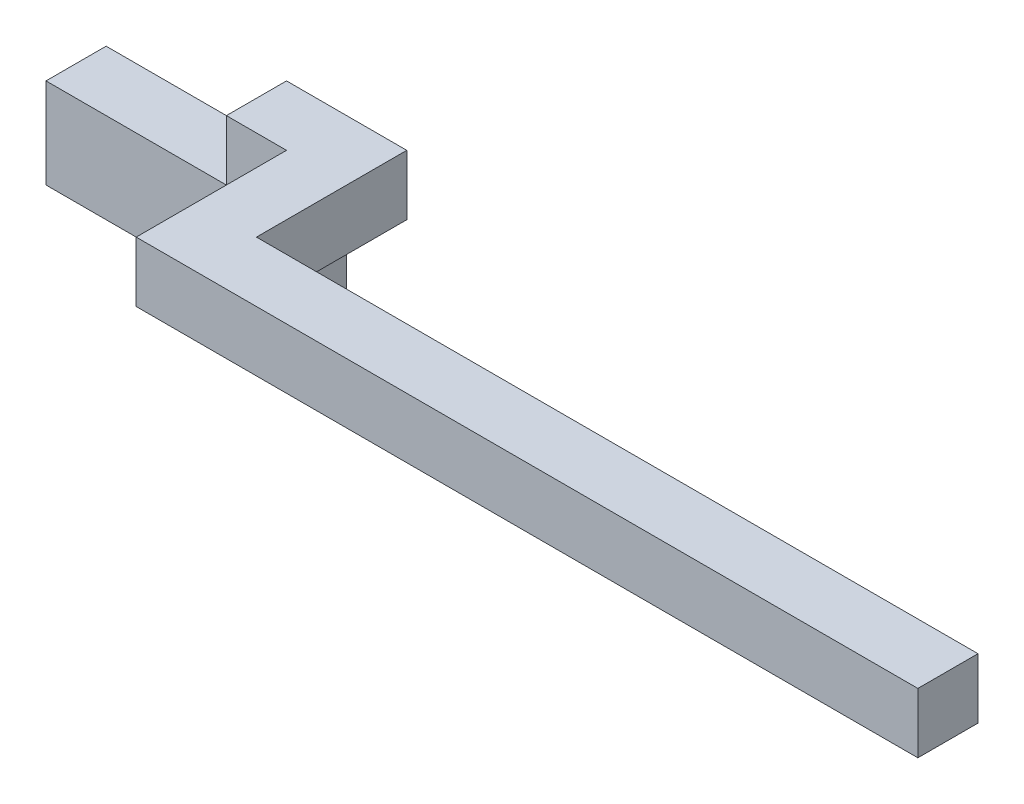
ISO-10303-21;
HEADER;
FILE_DESCRIPTION(('STEP AP214'),'2;1');
FILE_NAME('part.step','',(''),(''),'','','');
FILE_SCHEMA(('AUTOMOTIVE_DESIGN { 1 0 10303 214 1 1 1 1 }'));
ENDSEC;
DATA;
#1=APPLICATION_CONTEXT('core data for automotive mechanical design processes');
#2=APPLICATION_PROTOCOL_DEFINITION('international standard','automotive_design',2000,#1);
#3=PRODUCT_CONTEXT('',#1,'mechanical');
#4=PRODUCT('Part','Part','',(#3));
#5=PRODUCT_RELATED_PRODUCT_CATEGORY('part','',(#4));
#6=PRODUCT_DEFINITION_FORMATION('','',#4);
#7=PRODUCT_DEFINITION_CONTEXT('part definition',#1,'design');
#8=PRODUCT_DEFINITION('design','',#6,#7);
#9=PRODUCT_DEFINITION_SHAPE('','',#8);
#10=(LENGTH_UNIT() NAMED_UNIT(*) SI_UNIT(.MILLI.,.METRE.));
#11=(NAMED_UNIT(*) PLANE_ANGLE_UNIT() SI_UNIT($,.RADIAN.));
#12=(NAMED_UNIT(*) SI_UNIT($,.STERADIAN.) SOLID_ANGLE_UNIT());
#13=UNCERTAINTY_MEASURE_WITH_UNIT(LENGTH_MEASURE(1.E-05),#10,'distance_accuracy_value','');
#14=(GEOMETRIC_REPRESENTATION_CONTEXT(3) GLOBAL_UNCERTAINTY_ASSIGNED_CONTEXT((#13)) GLOBAL_UNIT_ASSIGNED_CONTEXT((#10,
#11,#12)) REPRESENTATION_CONTEXT('',''));
#15=CARTESIAN_POINT('',(0.,0.,0.));
#16=DIRECTION('',(0.,0.,1.));
#17=DIRECTION('',(1.,0.,0.));
#18=AXIS2_PLACEMENT_3D('',#15,#16,#17);
#19=CARTESIAN_POINT('',(330.2,-38.1,0.));
#20=DIRECTION('',(1.,0.,0.));
#21=DIRECTION('',(0.,0.,-1.));
#22=AXIS2_PLACEMENT_3D('',#19,#20,#21);
#23=PLANE('',#22);
#24=DIRECTION('',(0.,1.,0.));
#25=VECTOR('',#24,1.);
#26=CARTESIAN_POINT('',(330.2,-38.1,63.5));
#27=LINE('',#26,#25);
#28=CARTESIAN_POINT('',(330.2,0.,63.5));
#29=VERTEX_POINT('',#28);
#30=CARTESIAN_POINT('',(330.2,25.4,63.5));
#31=VERTEX_POINT('',#30);
#32=EDGE_CURVE('E192',#29,#31,#27,.T.);
#33=ORIENTED_EDGE('',*,*,#32,.T.);
#34=DIRECTION('',(0.,0.,1.));
#35=VECTOR('',#34,1.);
#36=CARTESIAN_POINT('',(330.2,25.4,0.));
#37=LINE('',#36,#35);
#38=CARTESIAN_POINT('',(330.2,25.4,88.9));
#39=VERTEX_POINT('',#38);
#40=EDGE_CURVE('E156',#31,#39,#37,.T.);
#41=ORIENTED_EDGE('',*,*,#40,.T.);
#42=DIRECTION('',(0.,1.,0.));
#43=VECTOR('',#42,1.);
#44=CARTESIAN_POINT('',(330.2,25.4,88.9));
#45=LINE('',#44,#43);
#46=CARTESIAN_POINT('',(330.2,0.,88.9));
#47=VERTEX_POINT('',#46);
#48=EDGE_CURVE('E169',#47,#39,#45,.T.);
#49=ORIENTED_EDGE('',*,*,#48,.F.);
#50=DIRECTION('',(0.,0.,-1.));
#51=VECTOR('',#50,1.);
#52=CARTESIAN_POINT('',(330.2,0.,25.4));
#53=LINE('',#52,#51);
#54=EDGE_CURVE('E164',#47,#29,#53,.T.);
#55=ORIENTED_EDGE('',*,*,#54,.T.);
#56=EDGE_LOOP('',(#33,#41,#49,#55));
#57=FACE_BOUND('',#56,.T.);
#58=ADVANCED_FACE('F33',(#57),#23,.T.);
#59=CARTESIAN_POINT('',(-101.6,-38.1,0.));
#60=DIRECTION('',(0.,-1.,0.));
#61=DIRECTION('',(0.,0.,-1.));
#62=AXIS2_PLACEMENT_3D('',#59,#60,#61);
#63=PLANE('',#62);
#64=DIRECTION('',(0.,0.,-1.));
#65=VECTOR('',#64,1.);
#66=CARTESIAN_POINT('',(0.,-38.1,25.4));
#67=LINE('',#66,#65);
#68=CARTESIAN_POINT('',(0.,-38.1,25.4));
#69=VERTEX_POINT('',#68);
#70=CARTESIAN_POINT('',(0.,-38.1,0.));
#71=VERTEX_POINT('',#70);
#72=EDGE_CURVE('E151',#69,#71,#67,.T.);
#73=ORIENTED_EDGE('',*,*,#72,.F.);
#74=DIRECTION('',(1.,0.,0.));
#75=VECTOR('',#74,1.);
#76=CARTESIAN_POINT('',(-101.6,-38.1,25.4));
#77=LINE('',#76,#75);
#78=CARTESIAN_POINT('',(-101.6,-38.1,25.4));
#79=VERTEX_POINT('',#78);
#80=EDGE_CURVE('E143',#79,#69,#77,.T.);
#81=ORIENTED_EDGE('',*,*,#80,.F.);
#82=DIRECTION('',(0.,0.,1.));
#83=VECTOR('',#82,1.);
#84=CARTESIAN_POINT('',(-101.6,-38.1,0.));
#85=LINE('',#84,#83);
#86=CARTESIAN_POINT('',(-101.6,-38.1,0.));
#87=VERTEX_POINT('',#86);
#88=EDGE_CURVE('E179',#87,#79,#85,.T.);
#89=ORIENTED_EDGE('',*,*,#88,.F.);
#90=DIRECTION('',(1.,0.,0.));
#91=VECTOR('',#90,1.);
#92=CARTESIAN_POINT('',(-101.6,-38.1,0.));
#93=LINE('',#92,#91);
#94=EDGE_CURVE('E145',#87,#71,#93,.T.);
#95=ORIENTED_EDGE('',*,*,#94,.T.);
#96=EDGE_LOOP('',(#73,#81,#89,#95));
#97=FACE_BOUND('',#96,.T.);
#98=ADVANCED_FACE('F227',(#97),#63,.T.);
#99=CARTESIAN_POINT('',(-101.6,25.4,0.));
#100=DIRECTION('',(-1.,0.,0.));
#101=DIRECTION('',(0.,-1.,0.));
#102=AXIS2_PLACEMENT_3D('',#99,#100,#101);
#103=PLANE('',#102);
#104=DIRECTION('',(0.,0.,1.));
#105=VECTOR('',#104,1.);
#106=CARTESIAN_POINT('',(-101.6,0.,0.));
#107=LINE('',#106,#105);
#108=CARTESIAN_POINT('',(-101.6,0.,0.));
#109=VERTEX_POINT('',#108);
#110=CARTESIAN_POINT('',(-101.6,0.,25.4));
#111=VERTEX_POINT('',#110);
#112=EDGE_CURVE('E55',#109,#111,#107,.T.);
#113=ORIENTED_EDGE('',*,*,#112,.F.);
#114=DIRECTION('',(0.,-1.,0.));
#115=VECTOR('',#114,1.);
#116=CARTESIAN_POINT('',(-101.6,25.4,0.));
#117=LINE('',#116,#115);
#118=EDGE_CURVE('E142',#109,#87,#117,.T.);
#119=ORIENTED_EDGE('',*,*,#118,.T.);
#120=ORIENTED_EDGE('',*,*,#88,.T.);
#121=DIRECTION('',(0.,-1.,0.));
#122=VECTOR('',#121,1.);
#123=CARTESIAN_POINT('',(-101.6,25.4,25.4));
#124=LINE('',#123,#122);
#125=EDGE_CURVE('E148',#111,#79,#124,.T.);
#126=ORIENTED_EDGE('',*,*,#125,.F.);
#127=EDGE_LOOP('',(#113,#119,#120,#126));
#128=FACE_BOUND('',#127,.T.);
#129=ADVANCED_FACE('F232',(#128),#103,.T.);
#130=CARTESIAN_POINT('',(330.2,25.4,0.));
#131=DIRECTION('',(0.,1.,0.));
#132=DIRECTION('',(0.,0.,1.));
#133=AXIS2_PLACEMENT_3D('',#130,#131,#132);
#134=PLANE('',#133);
#135=DIRECTION('',(1.,0.,0.));
#136=VECTOR('',#135,1.);
#137=CARTESIAN_POINT('',(25.4,25.4,63.5));
#138=LINE('',#137,#136);
#139=CARTESIAN_POINT('',(25.4,25.4,63.5));
#140=VERTEX_POINT('',#139);
#141=EDGE_CURVE('E127',#140,#31,#138,.T.);
#142=ORIENTED_EDGE('',*,*,#141,.F.);
#143=DIRECTION('',(0.,0.,1.));
#144=VECTOR('',#143,1.);
#145=CARTESIAN_POINT('',(25.4,25.4,0.));
#146=LINE('',#145,#144);
#147=CARTESIAN_POINT('',(25.4,25.4,0.));
#148=VERTEX_POINT('',#147);
#149=EDGE_CURVE('E120',#148,#140,#146,.T.);
#150=ORIENTED_EDGE('',*,*,#149,.F.);
#151=DIRECTION('',(-1.,0.,0.));
#152=VECTOR('',#151,1.);
#153=CARTESIAN_POINT('',(330.2,25.4,0.));
#154=LINE('',#153,#152);
#155=CARTESIAN_POINT('',(-25.4,25.4,0.));
#156=VERTEX_POINT('',#155);
#157=EDGE_CURVE('E132',#148,#156,#154,.T.);
#158=ORIENTED_EDGE('',*,*,#157,.T.);
#159=DIRECTION('',(0.,0.,1.));
#160=VECTOR('',#159,1.);
#161=CARTESIAN_POINT('',(-25.4,25.4,0.));
#162=LINE('',#161,#160);
#163=CARTESIAN_POINT('',(-25.4,25.4,25.4));
#164=VERTEX_POINT('',#163);
#165=EDGE_CURVE('E170',#156,#164,#162,.T.);
#166=ORIENTED_EDGE('',*,*,#165,.T.);
#167=DIRECTION('',(-1.,0.,0.));
#168=VECTOR('',#167,1.);
#169=CARTESIAN_POINT('',(330.2,25.4,25.4));
#170=LINE('',#169,#168);
#171=CARTESIAN_POINT('',(0.,25.4,25.4));
#172=VERTEX_POINT('',#171);
#173=EDGE_CURVE('E160',#172,#164,#170,.T.);
#174=ORIENTED_EDGE('',*,*,#173,.F.);
#175=DIRECTION('',(0.,0.,-1.));
#176=VECTOR('',#175,1.);
#177=CARTESIAN_POINT('',(0.,25.4,88.9));
#178=LINE('',#177,#176);
#179=CARTESIAN_POINT('',(0.,25.4,88.9));
#180=VERTEX_POINT('',#179);
#181=EDGE_CURVE('E173',#180,#172,#178,.T.);
#182=ORIENTED_EDGE('',*,*,#181,.F.);
#183=DIRECTION('',(-1.,0.,0.));
#184=VECTOR('',#183,1.);
#185=CARTESIAN_POINT('',(0.,25.4,88.9));
#186=LINE('',#185,#184);
#187=EDGE_CURVE('E194',#39,#180,#186,.T.);
#188=ORIENTED_EDGE('',*,*,#187,.F.);
#189=ORIENTED_EDGE('',*,*,#40,.F.);
#190=EDGE_LOOP('',(#142,#150,#158,#166,#174,#182,#188,#189));
#191=FACE_BOUND('',#190,.T.);
#192=ADVANCED_FACE('F130',(#191),#134,.T.);
#193=CARTESIAN_POINT('',(0.,0.,0.));
#194=DIRECTION('',(0.,0.,1.));
#195=DIRECTION('',(1.,0.,0.));
#196=AXIS2_PLACEMENT_3D('',#193,#194,#195);
#197=PLANE('',#196);
#198=CARTESIAN_POINT('',(12.7,12.7,0.));
#199=DIRECTION('',(0.,0.,-1.));
#200=DIRECTION('',(0.,1.,0.));
#201=AXIS2_PLACEMENT_3D('',#198,#199,#200);
#202=CIRCLE('',#201,6.35000000000001);
#203=CARTESIAN_POINT('',(12.7,19.05,0.));
#204=VERTEX_POINT('',#203);
#205=EDGE_CURVE('E256',#204,#204,#202,.T.);
#206=ORIENTED_EDGE('',*,*,#205,.F.);
#207=EDGE_LOOP('',(#206));
#208=FACE_BOUND('',#207,.T.);
#209=ORIENTED_EDGE('',*,*,#157,.F.);
#210=DIRECTION('',(0.,1.,0.));
#211=VECTOR('',#210,1.);
#212=CARTESIAN_POINT('',(25.4,-38.1,0.));
#213=LINE('',#212,#211);
#214=CARTESIAN_POINT('',(25.4,0.,0.));
#215=VERTEX_POINT('',#214);
#216=EDGE_CURVE('E117',#215,#148,#213,.T.);
#217=ORIENTED_EDGE('',*,*,#216,.F.);
#218=DIRECTION('',(1.,0.,0.));
#219=VECTOR('',#218,1.);
#220=CARTESIAN_POINT('',(0.,0.,0.));
#221=LINE('',#220,#219);
#222=CARTESIAN_POINT('',(0.,0.,0.));
#223=VERTEX_POINT('',#222);
#224=EDGE_CURVE('E214',#223,#215,#221,.T.);
#225=ORIENTED_EDGE('',*,*,#224,.F.);
#226=DIRECTION('',(0.,1.,0.));
#227=VECTOR('',#226,1.);
#228=CARTESIAN_POINT('',(0.,-38.1,0.));
#229=LINE('',#228,#227);
#230=EDGE_CURVE('E176',#71,#223,#229,.T.);
#231=ORIENTED_EDGE('',*,*,#230,.F.);
#232=ORIENTED_EDGE('',*,*,#94,.F.);
#233=ORIENTED_EDGE('',*,*,#118,.F.);
#234=DIRECTION('',(1.,0.,0.));
#235=VECTOR('',#234,1.);
#236=CARTESIAN_POINT('',(-101.6,0.,0.));
#237=LINE('',#236,#235);
#238=CARTESIAN_POINT('',(-25.4,0.,0.));
#239=VERTEX_POINT('',#238);
#240=EDGE_CURVE('E234',#109,#239,#237,.T.);
#241=ORIENTED_EDGE('',*,*,#240,.T.);
#242=DIRECTION('',(0.,1.,0.));
#243=VECTOR('',#242,1.);
#244=CARTESIAN_POINT('',(-25.4,0.,0.));
#245=LINE('',#244,#243);
#246=EDGE_CURVE('E141',#239,#156,#245,.T.);
#247=ORIENTED_EDGE('',*,*,#246,.T.);
#248=EDGE_LOOP('',(#209,#217,#225,#231,#232,#233,#241,#247));
#249=FACE_BOUND('',#248,.T.);
#250=ADVANCED_FACE('F138',(#208,#249),#197,.F.);
#251=CARTESIAN_POINT('',(0.,0.,25.4));
#252=DIRECTION('',(0.,0.,1.));
#253=DIRECTION('',(1.,0.,0.));
#254=AXIS2_PLACEMENT_3D('',#251,#252,#253);
#255=PLANE('',#254);
#256=DIRECTION('',(0.,1.,0.));
#257=VECTOR('',#256,1.);
#258=CARTESIAN_POINT('',(-25.4,0.,25.4));
#259=LINE('',#258,#257);
#260=CARTESIAN_POINT('',(-25.4,0.,25.4));
#261=VERTEX_POINT('',#260);
#262=EDGE_CURVE('E235',#261,#164,#259,.T.);
#263=ORIENTED_EDGE('',*,*,#262,.F.);
#264=DIRECTION('',(1.,0.,0.));
#265=VECTOR('',#264,1.);
#266=CARTESIAN_POINT('',(-101.6,0.,25.4));
#267=LINE('',#266,#265);
#268=EDGE_CURVE('E231',#111,#261,#267,.T.);
#269=ORIENTED_EDGE('',*,*,#268,.F.);
#270=ORIENTED_EDGE('',*,*,#125,.T.);
#271=ORIENTED_EDGE('',*,*,#80,.T.);
#272=DIRECTION('',(0.,1.,0.));
#273=VECTOR('',#272,1.);
#274=CARTESIAN_POINT('',(0.,-38.1,25.4));
#275=LINE('',#274,#273);
#276=CARTESIAN_POINT('',(0.,0.,25.4));
#277=VERTEX_POINT('',#276);
#278=EDGE_CURVE('E212',#69,#277,#275,.T.);
#279=ORIENTED_EDGE('',*,*,#278,.T.);
#280=DIRECTION('',(0.,-1.,0.));
#281=VECTOR('',#280,1.);
#282=CARTESIAN_POINT('',(0.,0.,25.4));
#283=LINE('',#282,#281);
#284=EDGE_CURVE('E166',#172,#277,#283,.T.);
#285=ORIENTED_EDGE('',*,*,#284,.F.);
#286=ORIENTED_EDGE('',*,*,#173,.T.);
#287=EDGE_LOOP('',(#263,#269,#270,#271,#279,#285,#286));
#288=FACE_BOUND('',#287,.T.);
#289=ADVANCED_FACE('F230',(#288),#255,.T.);
#290=CARTESIAN_POINT('',(0.,0.,25.4));
#291=DIRECTION('',(0.,1.,0.));
#292=DIRECTION('',(0.,0.,1.));
#293=AXIS2_PLACEMENT_3D('',#290,#291,#292);
#294=PLANE('',#293);
#295=DIRECTION('',(0.,0.,1.));
#296=VECTOR('',#295,1.);
#297=CARTESIAN_POINT('',(25.4,0.,25.4));
#298=LINE('',#297,#296);
#299=CARTESIAN_POINT('',(25.4,0.,63.5));
#300=VERTEX_POINT('',#299);
#301=EDGE_CURVE('E40',#215,#300,#298,.T.);
#302=ORIENTED_EDGE('',*,*,#301,.T.);
#303=DIRECTION('',(1.,0.,0.));
#304=VECTOR('',#303,1.);
#305=CARTESIAN_POINT('',(0.,0.,63.5));
#306=LINE('',#305,#304);
#307=EDGE_CURVE('E11',#300,#29,#306,.T.);
#308=ORIENTED_EDGE('',*,*,#307,.T.);
#309=ORIENTED_EDGE('',*,*,#54,.F.);
#310=DIRECTION('',(1.,0.,0.));
#311=VECTOR('',#310,1.);
#312=CARTESIAN_POINT('',(330.2,0.,88.9));
#313=LINE('',#312,#311);
#314=CARTESIAN_POINT('',(0.,0.,88.9));
#315=VERTEX_POINT('',#314);
#316=EDGE_CURVE('E203',#315,#47,#313,.T.);
#317=ORIENTED_EDGE('',*,*,#316,.F.);
#318=DIRECTION('',(0.,0.,-1.));
#319=VECTOR('',#318,1.);
#320=CARTESIAN_POINT('',(0.,0.,88.9));
#321=LINE('',#320,#319);
#322=EDGE_CURVE('E177',#315,#277,#321,.T.);
#323=ORIENTED_EDGE('',*,*,#322,.T.);
#324=DIRECTION('',(0.,0.,-1.));
#325=VECTOR('',#324,1.);
#326=CARTESIAN_POINT('',(0.,0.,25.4));
#327=LINE('',#326,#325);
#328=EDGE_CURVE('E218',#277,#223,#327,.T.);
#329=ORIENTED_EDGE('',*,*,#328,.T.);
#330=ORIENTED_EDGE('',*,*,#224,.T.);
#331=EDGE_LOOP('',(#302,#308,#309,#317,#323,#329,#330));
#332=FACE_BOUND('',#331,.T.);
#333=ADVANCED_FACE('F248',(#332),#294,.F.);
#334=CARTESIAN_POINT('',(0.,-38.1,25.4));
#335=DIRECTION('',(-1.,0.,0.));
#336=DIRECTION('',(0.,0.,1.));
#337=AXIS2_PLACEMENT_3D('',#334,#335,#336);
#338=PLANE('',#337);
#339=ORIENTED_EDGE('',*,*,#230,.T.);
#340=ORIENTED_EDGE('',*,*,#328,.F.);
#341=ORIENTED_EDGE('',*,*,#278,.F.);
#342=ORIENTED_EDGE('',*,*,#72,.T.);
#343=EDGE_LOOP('',(#339,#340,#341,#342));
#344=FACE_BOUND('',#343,.T.);
#345=ADVANCED_FACE('F223',(#344),#338,.F.);
#346=CARTESIAN_POINT('',(0.,0.,88.9));
#347=DIRECTION('',(1.,0.,0.));
#348=DIRECTION('',(0.,0.,-1.));
#349=AXIS2_PLACEMENT_3D('',#346,#347,#348);
#350=PLANE('',#349);
#351=ORIENTED_EDGE('',*,*,#284,.T.);
#352=ORIENTED_EDGE('',*,*,#322,.F.);
#353=DIRECTION('',(0.,-1.,0.));
#354=VECTOR('',#353,1.);
#355=CARTESIAN_POINT('',(0.,0.,88.9));
#356=LINE('',#355,#354);
#357=EDGE_CURVE('E198',#180,#315,#356,.T.);
#358=ORIENTED_EDGE('',*,*,#357,.F.);
#359=ORIENTED_EDGE('',*,*,#181,.T.);
#360=EDGE_LOOP('',(#351,#352,#358,#359));
#361=FACE_BOUND('',#360,.T.);
#362=ADVANCED_FACE('F246',(#361),#350,.F.);
#363=CARTESIAN_POINT('',(0.,0.,88.9));
#364=DIRECTION('',(0.,0.,-1.));
#365=DIRECTION('',(-1.,0.,0.));
#366=AXIS2_PLACEMENT_3D('',#363,#364,#365);
#367=PLANE('',#366);
#368=ORIENTED_EDGE('',*,*,#48,.T.);
#369=ORIENTED_EDGE('',*,*,#187,.T.);
#370=ORIENTED_EDGE('',*,*,#357,.T.);
#371=ORIENTED_EDGE('',*,*,#316,.T.);
#372=EDGE_LOOP('',(#368,#369,#370,#371));
#373=FACE_BOUND('',#372,.T.);
#374=ADVANCED_FACE('F201',(#373),#367,.F.);
#375=CARTESIAN_POINT('',(-25.4,0.,0.));
#376=DIRECTION('',(1.,0.,0.));
#377=DIRECTION('',(0.,0.,-1.));
#378=AXIS2_PLACEMENT_3D('',#375,#376,#377);
#379=PLANE('',#378);
#380=ORIENTED_EDGE('',*,*,#262,.T.);
#381=ORIENTED_EDGE('',*,*,#165,.F.);
#382=ORIENTED_EDGE('',*,*,#246,.F.);
#383=DIRECTION('',(0.,0.,1.));
#384=VECTOR('',#383,1.);
#385=CARTESIAN_POINT('',(-25.4,0.,0.));
#386=LINE('',#385,#384);
#387=EDGE_CURVE('E233',#239,#261,#386,.T.);
#388=ORIENTED_EDGE('',*,*,#387,.T.);
#389=EDGE_LOOP('',(#380,#381,#382,#388));
#390=FACE_BOUND('',#389,.T.);
#391=ADVANCED_FACE('F243',(#390),#379,.F.);
#392=CARTESIAN_POINT('',(-101.6,0.,0.));
#393=DIRECTION('',(0.,-1.,0.));
#394=DIRECTION('',(0.,0.,-1.));
#395=AXIS2_PLACEMENT_3D('',#392,#393,#394);
#396=PLANE('',#395);
#397=ORIENTED_EDGE('',*,*,#268,.T.);
#398=ORIENTED_EDGE('',*,*,#387,.F.);
#399=ORIENTED_EDGE('',*,*,#240,.F.);
#400=ORIENTED_EDGE('',*,*,#112,.T.);
#401=EDGE_LOOP('',(#397,#398,#399,#400));
#402=FACE_BOUND('',#401,.T.);
#403=ADVANCED_FACE('F244',(#402),#396,.F.);
#404=CARTESIAN_POINT('',(25.4,-38.1,63.5));
#405=DIRECTION('',(0.,0.,1.));
#406=DIRECTION('',(1.,0.,0.));
#407=AXIS2_PLACEMENT_3D('',#404,#405,#406);
#408=PLANE('',#407);
#409=DIRECTION('',(0.,1.,0.));
#410=VECTOR('',#409,1.);
#411=CARTESIAN_POINT('',(25.4,-38.1,63.5));
#412=LINE('',#411,#410);
#413=EDGE_CURVE('E47',#300,#140,#412,.T.);
#414=ORIENTED_EDGE('',*,*,#413,.T.);
#415=ORIENTED_EDGE('',*,*,#141,.T.);
#416=ORIENTED_EDGE('',*,*,#32,.F.);
#417=ORIENTED_EDGE('',*,*,#307,.F.);
#418=EDGE_LOOP('',(#414,#415,#416,#417));
#419=FACE_BOUND('',#418,.T.);
#420=ADVANCED_FACE('F250',(#419),#408,.F.);
#421=CARTESIAN_POINT('',(25.4,-38.1,0.));
#422=DIRECTION('',(-1.,0.,0.));
#423=DIRECTION('',(0.,0.,1.));
#424=AXIS2_PLACEMENT_3D('',#421,#422,#423);
#425=PLANE('',#424);
#426=ORIENTED_EDGE('',*,*,#216,.T.);
#427=ORIENTED_EDGE('',*,*,#149,.T.);
#428=ORIENTED_EDGE('',*,*,#413,.F.);
#429=ORIENTED_EDGE('',*,*,#301,.F.);
#430=EDGE_LOOP('',(#426,#427,#428,#429));
#431=FACE_BOUND('',#430,.T.);
#432=ADVANCED_FACE('F119',(#431),#425,.F.);
#433=CARTESIAN_POINT('',(12.7,12.7,5.08));
#434=DIRECTION('',(0.,0.,1.));
#435=DIRECTION('',(0.,-1.,0.));
#436=AXIS2_PLACEMENT_3D('',#433,#434,#435);
#437=PLANE('',#436);
#438=CARTESIAN_POINT('',(12.7,12.7,5.08));
#439=DIRECTION('',(0.,0.,-1.));
#440=DIRECTION('',(0.,1.,0.));
#441=AXIS2_PLACEMENT_3D('',#438,#439,#440);
#442=CIRCLE('',#441,6.35000000000001);
#443=CARTESIAN_POINT('',(12.7,19.05,5.08));
#444=VERTEX_POINT('',#443);
#445=EDGE_CURVE('E135',#444,#444,#442,.T.);
#446=ORIENTED_EDGE('',*,*,#445,.T.);
#447=EDGE_LOOP('',(#446));
#448=FACE_BOUND('',#447,.T.);
#449=ADVANCED_FACE('F320',(#448),#437,.F.);
#450=CARTESIAN_POINT('',(12.7,12.7,0.));
#451=DIRECTION('',(0.,0.,-1.));
#452=DIRECTION('',(0.,1.,0.));
#453=AXIS2_PLACEMENT_3D('',#450,#451,#452);
#454=CYLINDRICAL_SURFACE('',#453,6.35000000000001);
#455=ORIENTED_EDGE('',*,*,#445,.F.);
#456=EDGE_LOOP('',(#455));
#457=FACE_BOUND('',#456,.T.);
#458=ORIENTED_EDGE('',*,*,#205,.T.);
#459=EDGE_LOOP('',(#458));
#460=FACE_BOUND('',#459,.T.);
#461=ADVANCED_FACE('F260',(#457,#460),#454,.F.);
#462=CLOSED_SHELL('',(#58,#98,#129,#192,#250,#289,#333,#345,#362,#374,#391,#403,#420,#432,#449,#461));
#463=MANIFOLD_SOLID_BREP('B2',#462);
#464=ADVANCED_BREP_SHAPE_REPRESENTATION('',(#18,#463),#14);
#465=SHAPE_DEFINITION_REPRESENTATION(#9,#464);
ENDSEC;
END-ISO-10303-21;
